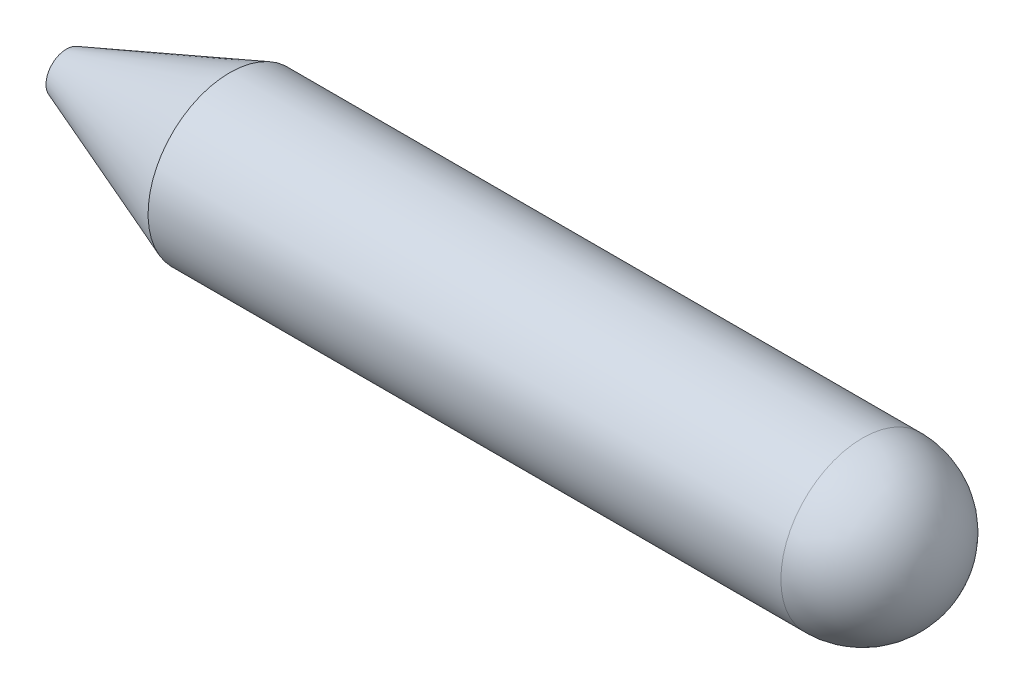
ISO-10303-21;
HEADER;
FILE_DESCRIPTION(('STEP AP214'),'2;1');
FILE_NAME('part.step','',(''),(''),'','','');
FILE_SCHEMA(('AUTOMOTIVE_DESIGN { 1 0 10303 214 1 1 1 1 }'));
ENDSEC;
DATA;
#1=APPLICATION_CONTEXT('core data for automotive mechanical design processes');
#2=APPLICATION_PROTOCOL_DEFINITION('international standard','automotive_design',2000,#1);
#3=PRODUCT_CONTEXT('',#1,'mechanical');
#4=PRODUCT('Part','Part','',(#3));
#5=PRODUCT_RELATED_PRODUCT_CATEGORY('part','',(#4));
#6=PRODUCT_DEFINITION_FORMATION('','',#4);
#7=PRODUCT_DEFINITION_CONTEXT('part definition',#1,'design');
#8=PRODUCT_DEFINITION('design','',#6,#7);
#9=PRODUCT_DEFINITION_SHAPE('','',#8);
#10=(LENGTH_UNIT() NAMED_UNIT(*) SI_UNIT(.MILLI.,.METRE.));
#11=(NAMED_UNIT(*) PLANE_ANGLE_UNIT() SI_UNIT($,.RADIAN.));
#12=(NAMED_UNIT(*) SI_UNIT($,.STERADIAN.) SOLID_ANGLE_UNIT());
#13=UNCERTAINTY_MEASURE_WITH_UNIT(LENGTH_MEASURE(1.E-05),#10,'distance_accuracy_value','');
#14=(GEOMETRIC_REPRESENTATION_CONTEXT(3) GLOBAL_UNCERTAINTY_ASSIGNED_CONTEXT((#13)) GLOBAL_UNIT_ASSIGNED_CONTEXT((#10,
#11,#12)) REPRESENTATION_CONTEXT('',''));
#15=CARTESIAN_POINT('',(0.,0.,0.));
#16=DIRECTION('',(0.,0.,1.));
#17=DIRECTION('',(1.,0.,0.));
#18=AXIS2_PLACEMENT_3D('',#15,#16,#17);
#19=CARTESIAN_POINT('',(-2.,0.,0.));
#20=DIRECTION('',(1.,0.,0.));
#21=DIRECTION('',(0.,-1.,0.));
#22=AXIS2_PLACEMENT_3D('',#19,#20,#21);
#23=SPHERICAL_SURFACE('',#22,2.);
#24=CARTESIAN_POINT('',(-2.,0.,0.));
#25=DIRECTION('',(1.,0.,0.));
#26=DIRECTION('',(0.,1.,0.));
#27=AXIS2_PLACEMENT_3D('',#24,#25,#26);
#28=CIRCLE('',#27,2.);
#29=CARTESIAN_POINT('',(-2.,2.,0.));
#30=VERTEX_POINT('',#29);
#31=EDGE_CURVE('E10',#30,#30,#28,.T.);
#32=ORIENTED_EDGE('',*,*,#31,.T.);
#33=EDGE_LOOP('',(#32));
#34=FACE_BOUND('',#33,.T.);
#35=ADVANCED_FACE('F38',(#34),#23,.T.);
#36=CARTESIAN_POINT('',(0.,0.,0.));
#37=DIRECTION('',(1.,0.,0.));
#38=DIRECTION('',(0.,1.,0.));
#39=AXIS2_PLACEMENT_3D('',#36,#37,#38);
#40=CYLINDRICAL_SURFACE('',#39,2.);
#41=CARTESIAN_POINT('',(-17.5,0.,0.));
#42=DIRECTION('',(1.,0.,0.));
#43=DIRECTION('',(0.,1.,0.));
#44=AXIS2_PLACEMENT_3D('',#41,#42,#43);
#45=CIRCLE('',#44,2.);
#46=CARTESIAN_POINT('',(-17.5,2.,0.));
#47=VERTEX_POINT('',#46);
#48=EDGE_CURVE('E44',#47,#47,#45,.T.);
#49=ORIENTED_EDGE('',*,*,#48,.T.);
#50=EDGE_LOOP('',(#49));
#51=FACE_BOUND('',#50,.T.);
#52=ORIENTED_EDGE('',*,*,#31,.F.);
#53=EDGE_LOOP('',(#52));
#54=FACE_BOUND('',#53,.T.);
#55=ADVANCED_FACE('F64',(#51,#54),#40,.T.);
#56=CARTESIAN_POINT('',(-17.5,0.,0.));
#57=DIRECTION('',(1.,0.,0.));
#58=DIRECTION('',(0.,1.,0.));
#59=AXIS2_PLACEMENT_3D('',#56,#57,#58);
#60=CONICAL_SURFACE('',#59,2.,0.358770670270573);
#61=CARTESIAN_POINT('',(-21.5,0.,0.));
#62=DIRECTION('',(1.,0.,0.));
#63=DIRECTION('',(0.,1.,0.));
#64=AXIS2_PLACEMENT_3D('',#61,#62,#63);
#65=CIRCLE('',#64,0.5);
#66=CARTESIAN_POINT('',(-21.5,0.499999999999997,0.));
#67=VERTEX_POINT('',#66);
#68=EDGE_CURVE('E48',#67,#67,#65,.T.);
#69=CARTESIAN_POINT('',(-21.5,0.499999999999997,0.));
#70=CARTESIAN_POINT('',(-21.4583333333333,0.515624999999996,0.));
#71=CARTESIAN_POINT('',(-21.4166666666667,0.531249999999996,0.));
#72=CARTESIAN_POINT('',(-21.3333333333333,0.562499999999997,0.));
#73=CARTESIAN_POINT('',(-21.2916666666667,0.578124999999997,0.));
#74=CARTESIAN_POINT('',(-21.2083333333333,0.609374999999997,0.));
#75=CARTESIAN_POINT('',(-21.1666666666667,0.624999999999997,0.));
#76=CARTESIAN_POINT('',(-21.0833333333333,0.656249999999997,0.));
#77=CARTESIAN_POINT('',(-21.0416666666667,0.671874999999997,0.));
#78=CARTESIAN_POINT('',(-20.9583333333333,0.703124999999997,0.));
#79=CARTESIAN_POINT('',(-20.9166666666667,0.718749999999997,0.));
#80=CARTESIAN_POINT('',(-20.8333333333333,0.749999999999997,0.));
#81=CARTESIAN_POINT('',(-20.7916666666667,0.765624999999997,0.));
#82=CARTESIAN_POINT('',(-20.7083333333333,0.796874999999997,0.));
#83=CARTESIAN_POINT('',(-20.6666666666667,0.812499999999997,0.));
#84=CARTESIAN_POINT('',(-20.5833333333333,0.843749999999997,0.));
#85=CARTESIAN_POINT('',(-20.5416666666667,0.859374999999997,0.));
#86=CARTESIAN_POINT('',(-20.4583333333333,0.890624999999997,0.));
#87=CARTESIAN_POINT('',(-20.4166666666667,0.906249999999997,0.));
#88=CARTESIAN_POINT('',(-20.3333333333333,0.937499999999997,0.));
#89=CARTESIAN_POINT('',(-20.2916666666667,0.953124999999997,0.));
#90=CARTESIAN_POINT('',(-20.2083333333333,0.984374999999997,0.));
#91=CARTESIAN_POINT('',(-20.1666666666667,0.999999999999997,0.));
#92=CARTESIAN_POINT('',(-20.0833333333333,1.03125,0.));
#93=CARTESIAN_POINT('',(-20.0416666666667,1.046875,0.));
#94=CARTESIAN_POINT('',(-19.9583333333333,1.078125,0.));
#95=CARTESIAN_POINT('',(-19.9166666666667,1.09375,0.));
#96=CARTESIAN_POINT('',(-19.8333333333333,1.125,0.));
#97=CARTESIAN_POINT('',(-19.7916666666667,1.140625,0.));
#98=CARTESIAN_POINT('',(-19.7083333333333,1.171875,0.));
#99=CARTESIAN_POINT('',(-19.6666666666667,1.1875,0.));
#100=CARTESIAN_POINT('',(-19.5833333333333,1.21875,0.));
#101=CARTESIAN_POINT('',(-19.5416666666667,1.234375,0.));
#102=CARTESIAN_POINT('',(-19.4583333333333,1.265625,0.));
#103=CARTESIAN_POINT('',(-19.4166666666667,1.28125,0.));
#104=CARTESIAN_POINT('',(-19.3333333333333,1.3125,0.));
#105=CARTESIAN_POINT('',(-19.2916666666667,1.328125,0.));
#106=CARTESIAN_POINT('',(-19.2083333333333,1.359375,0.));
#107=CARTESIAN_POINT('',(-19.1666666666667,1.375,0.));
#108=CARTESIAN_POINT('',(-19.0833333333333,1.40625,0.));
#109=CARTESIAN_POINT('',(-19.0416666666667,1.421875,0.));
#110=CARTESIAN_POINT('',(-18.9583333333333,1.453125,0.));
#111=CARTESIAN_POINT('',(-18.9166666666667,1.46875,0.));
#112=CARTESIAN_POINT('',(-18.8333333333333,1.5,0.));
#113=CARTESIAN_POINT('',(-18.7916666666667,1.515625,0.));
#114=CARTESIAN_POINT('',(-18.7083333333333,1.546875,0.));
#115=CARTESIAN_POINT('',(-18.6666666666667,1.5625,0.));
#116=CARTESIAN_POINT('',(-18.5833333333333,1.59375,0.));
#117=CARTESIAN_POINT('',(-18.5416666666667,1.609375,0.));
#118=CARTESIAN_POINT('',(-18.4583333333333,1.640625,0.));
#119=CARTESIAN_POINT('',(-18.4166666666667,1.65625,0.));
#120=CARTESIAN_POINT('',(-18.3333333333333,1.6875,0.));
#121=CARTESIAN_POINT('',(-18.2916666666667,1.703125,0.));
#122=CARTESIAN_POINT('',(-18.2083333333333,1.734375,0.));
#123=CARTESIAN_POINT('',(-18.1666666666667,1.75,0.));
#124=CARTESIAN_POINT('',(-18.0833333333333,1.78125,0.));
#125=CARTESIAN_POINT('',(-18.0416666666667,1.796875,0.));
#126=CARTESIAN_POINT('',(-17.9583333333333,1.828125,0.));
#127=CARTESIAN_POINT('',(-17.9166666666667,1.84375,0.));
#128=CARTESIAN_POINT('',(-17.8333333333333,1.875,0.));
#129=CARTESIAN_POINT('',(-17.7916666666667,1.890625,0.));
#130=CARTESIAN_POINT('',(-17.7083333333333,1.921875,0.));
#131=CARTESIAN_POINT('',(-17.6666666666667,1.9375,0.));
#132=CARTESIAN_POINT('',(-17.5833333333333,1.96875,0.));
#133=CARTESIAN_POINT('',(-17.5416666666667,1.984375,0.));
#134=CARTESIAN_POINT('',(-17.5,2.,0.));
#135=B_SPLINE_CURVE_WITH_KNOTS('',3,(#69,#70,#71,#72,#73,#74,#75,#76,#77,#78,#79,#80,#81,#82,
#83,#84,#85,#86,#87,#88,#89,#90,#91,#92,#93,#94,#95,#96,#97,#98,#99,#100,#101,#102,#103,#104,
#105,#106,#107,#108,#109,#110,#111,#112,#113,#114,#115,#116,#117,#118,#119,#120,#121,#122,#123,
#124,#125,#126,#127,#128,#129,#130,#131,#132,#133,#134),.UNSPECIFIED.,.F.,.F.,(4,2,2,2,2,2,2,2,
2,2,2,2,2,2,2,2,2,2,2,2,2,2,2,2,2,2,2,2,2,2,2,2,4),(0.,0.133500058520587,0.26700011704117,
0.400500175561756,0.534000234082343,0.667500292602929,0.801000351123516,0.934500409644103,
1.06800046816469,1.20150052668528,1.33500058520586,1.46850064372645,1.60200070224704,
1.73550076076762,1.86900081928821,2.00250087780879,2.13600093632938,2.26950099484997,
2.40300105337055,2.53650111189114,2.67000117041172,2.80350122893231,2.9370012874529,
3.07050134597348,3.20400140449407,3.33750146301466,3.47100152153524,3.60450158005583,
3.73800163857642,3.871501697097,4.00500175561759,4.13850181413818,4.27200187265876),.UNSPECIFIED.);
#136=EDGE_CURVE('BSEAM55',#67,#47,#135,.T.);
#137=ORIENTED_EDGE('',*,*,#68,.T.);
#138=ORIENTED_EDGE('',*,*,#48,.F.);
#139=ORIENTED_EDGE('',*,*,#136,.T.);
#140=ORIENTED_EDGE('',*,*,#136,.F.);
#141=EDGE_LOOP('',(#137,#139,#138,#140));
#142=FACE_BOUND('',#141,.T.);
#143=ADVANCED_FACE('F55',(#142),#60,.T.);
#144=CARTESIAN_POINT('',(-21.5,0.,0.));
#145=DIRECTION('',(-1.,0.,0.));
#146=DIRECTION('',(0.,-1.,0.));
#147=AXIS2_PLACEMENT_3D('',#144,#145,#146);
#148=PLANE('',#147);
#149=ORIENTED_EDGE('',*,*,#68,.F.);
#150=EDGE_LOOP('',(#149));
#151=FACE_BOUND('',#150,.T.);
#152=ADVANCED_FACE('F58',(#151),#148,.T.);
#153=CLOSED_SHELL('',(#35,#55,#143,#152));
#154=MANIFOLD_SOLID_BREP('B2',#153);
#155=ADVANCED_BREP_SHAPE_REPRESENTATION('',(#18,#154),#14);
#156=SHAPE_DEFINITION_REPRESENTATION(#9,#155);
ENDSEC;
END-ISO-10303-21;
